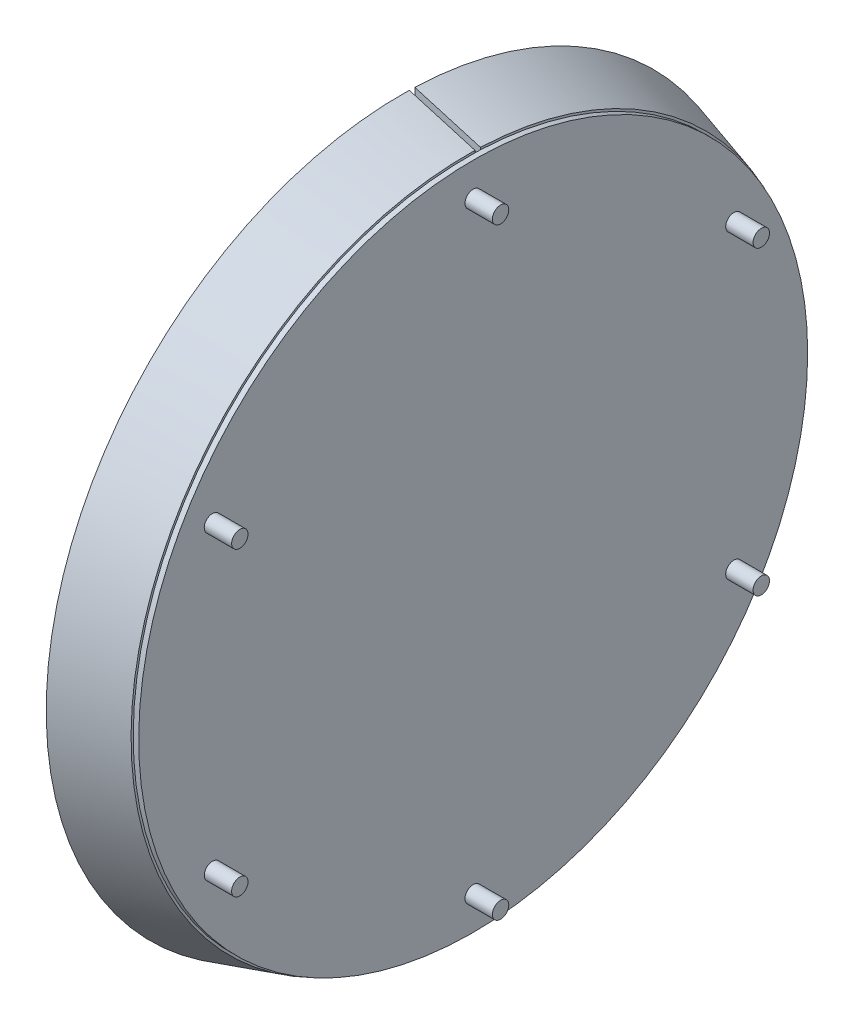
ISO-10303-21;
HEADER;
FILE_DESCRIPTION(('STEP AP214'),'2;1');
FILE_NAME('part.step','',(''),(''),'','','');
FILE_SCHEMA(('AUTOMOTIVE_DESIGN { 1 0 10303 214 1 1 1 1 }'));
ENDSEC;
DATA;
#1=APPLICATION_CONTEXT('core data for automotive mechanical design processes');
#2=APPLICATION_PROTOCOL_DEFINITION('international standard','automotive_design',2000,#1);
#3=PRODUCT_CONTEXT('',#1,'mechanical');
#4=PRODUCT('Part','Part','',(#3));
#5=PRODUCT_RELATED_PRODUCT_CATEGORY('part','',(#4));
#6=PRODUCT_DEFINITION_FORMATION('','',#4);
#7=PRODUCT_DEFINITION_CONTEXT('part definition',#1,'design');
#8=PRODUCT_DEFINITION('design','',#6,#7);
#9=PRODUCT_DEFINITION_SHAPE('','',#8);
#10=(LENGTH_UNIT() NAMED_UNIT(*) SI_UNIT(.MILLI.,.METRE.));
#11=(NAMED_UNIT(*) PLANE_ANGLE_UNIT() SI_UNIT($,.RADIAN.));
#12=(NAMED_UNIT(*) SI_UNIT($,.STERADIAN.) SOLID_ANGLE_UNIT());
#13=UNCERTAINTY_MEASURE_WITH_UNIT(LENGTH_MEASURE(1.E-05),#10,'distance_accuracy_value','');
#14=(GEOMETRIC_REPRESENTATION_CONTEXT(3) GLOBAL_UNCERTAINTY_ASSIGNED_CONTEXT((#13)) GLOBAL_UNIT_ASSIGNED_CONTEXT((#10,
#11,#12)) REPRESENTATION_CONTEXT('',''));
#15=CARTESIAN_POINT('',(0.,0.,0.));
#16=DIRECTION('',(0.,0.,1.));
#17=DIRECTION('',(1.,0.,0.));
#18=AXIS2_PLACEMENT_3D('',#15,#16,#17);
#19=CARTESIAN_POINT('',(12.,0.,0.));
#20=DIRECTION('',(-1.,0.,0.));
#21=DIRECTION('',(0.,0.,1.));
#22=AXIS2_PLACEMENT_3D('',#19,#20,#21);
#23=CONICAL_SURFACE('',#22,61.5,0.283794109208328);
#24=CARTESIAN_POINT('',(12.,0.,0.));
#25=DIRECTION('',(-1.,0.,0.));
#26=DIRECTION('',(0.,0.,1.));
#27=AXIS2_PLACEMENT_3D('',#24,#25,#26);
#28=CIRCLE('',#27,61.5);
#29=CARTESIAN_POINT('',(12.,61.4559242696827,-2.32795450106531));
#30=VERTEX_POINT('',#29);
#31=CARTESIAN_POINT('',(12.,61.485661229616,-1.32795450106531));
#32=VERTEX_POINT('',#31);
#33=EDGE_CURVE('E108',#30,#32,#28,.T.);
#34=ORIENTED_EDGE('',*,*,#33,.T.);
#35=CARTESIAN_POINT('',(24.8748500304677,57.72956394357,-1.32795450106531));
#36=CARTESIAN_POINT('',(18.5832524393234,59.5650919039046,-1.32795450106531));
#37=CARTESIAN_POINT('',(12.2916453053325,61.4005871531755,-1.32795450106531));
#38=CARTESIAN_POINT('',(-0.291588048312617,65.0715122295808,-1.32795450106531));
#39=CARTESIAN_POINT('',(-6.5832142679669,66.9069420567153,-1.32795450106531));
#40=CARTESIAN_POINT('',(-12.8748500304677,68.7423391727859,-1.32795450106531));
#41=B_SPLINE_CURVE_WITH_KNOTS('',3,(#35,#36,#37,#38,#39,#40),.UNSPECIFIED.,.F.,.F.,(4,2,4),(0.,
19.6616445967071,39.3232891933217),.UNSPECIFIED.);
#42=CARTESIAN_POINT('',(0.,64.9864334830209,-1.32795450106531));
#43=VERTEX_POINT('',#42);
#44=EDGE_CURVE('E179',#32,#43,#41,.T.);
#45=ORIENTED_EDGE('',*,*,#44,.T.);
#46=CARTESIAN_POINT('',(0.,0.,0.));
#47=DIRECTION('',(-1.,0.,0.));
#48=DIRECTION('',(0.,0.,1.));
#49=AXIS2_PLACEMENT_3D('',#46,#47,#48);
#50=CIRCLE('',#49,65.);
#51=CARTESIAN_POINT('',(0.,64.9582991452283,-2.32795450106531));
#52=VERTEX_POINT('',#51);
#53=EDGE_CURVE('E196',#52,#43,#50,.T.);
#54=ORIENTED_EDGE('',*,*,#53,.F.);
#55=CARTESIAN_POINT('',(-12.8748500304677,68.7157426354703,-2.32795450106531));
#56=CARTESIAN_POINT('',(-6.58317459645106,66.8796353721569,-2.32795450106531));
#57=CARTESIAN_POINT('',(-0.291528541101549,65.0434274507546,-2.32795450106531));
#58=CARTESIAN_POINT('',(12.2917048125436,61.3708102916908,-2.32795450106531));
#59=CARTESIAN_POINT('',(18.5832921108392,59.5344010540293,-2.32795450106531));
#60=CARTESIAN_POINT('',(24.8748500304677,57.6978911582789,-2.32795450106531));
#61=B_SPLINE_CURVE_WITH_KNOTS('',3,(#55,#56,#57,#58,#59,#60),.UNSPECIFIED.,.F.,.F.,(4,2,4),(0.,
19.66235556966,39.3247111401961),.UNSPECIFIED.);
#62=EDGE_CURVE('E208',#52,#30,#61,.T.);
#63=ORIENTED_EDGE('',*,*,#62,.T.);
#64=EDGE_LOOP('',(#34,#45,#54,#63));
#65=FACE_BOUND('',#64,.T.);
#66=ADVANCED_FACE('F39',(#65),#23,.T.);
#67=CARTESIAN_POINT('',(0.,65.,0.));
#68=DIRECTION('',(1.,0.,0.));
#69=DIRECTION('',(0.,0.,-1.));
#70=AXIS2_PLACEMENT_3D('',#67,#68,#69);
#71=PLANE('',#70);
#72=ORIENTED_EDGE('',*,*,#53,.T.);
#73=DIRECTION('',(0.,1.,0.));
#74=VECTOR('',#73,1.);
#75=CARTESIAN_POINT('',(0.,69.3356014956887,-1.32795450106531));
#76=LINE('',#75,#74);
#77=CARTESIAN_POINT('',(0.,63.4861129448252,-1.32795450106531));
#78=VERTEX_POINT('',#77);
#79=EDGE_CURVE('E131',#78,#43,#76,.T.);
#80=ORIENTED_EDGE('',*,*,#79,.F.);
#81=CARTESIAN_POINT('',(0.,0.,0.));
#82=DIRECTION('',(-1.,0.,0.));
#83=DIRECTION('',(0.,0.,1.));
#84=AXIS2_PLACEMENT_3D('',#81,#82,#83);
#85=CIRCLE('',#84,63.5);
#86=CARTESIAN_POINT('',(0.,63.4573134306911,-2.32795450106531));
#87=VERTEX_POINT('',#86);
#88=EDGE_CURVE('E193',#87,#78,#85,.T.);
#89=ORIENTED_EDGE('',*,*,#88,.F.);
#90=DIRECTION('',(0.,-1.,0.));
#91=VECTOR('',#90,1.);
#92=CARTESIAN_POINT('',(0.,69.3356014956887,-2.32795450106531));
#93=LINE('',#92,#91);
#94=EDGE_CURVE('E128',#52,#87,#93,.T.);
#95=ORIENTED_EDGE('',*,*,#94,.F.);
#96=EDGE_LOOP('',(#72,#80,#89,#95));
#97=FACE_BOUND('',#96,.T.);
#98=ADVANCED_FACE('F221',(#97),#71,.F.);
#99=CARTESIAN_POINT('',(0.,0.,0.));
#100=DIRECTION('',(-1.,0.,0.));
#101=DIRECTION('',(0.,0.,1.));
#102=AXIS2_PLACEMENT_3D('',#99,#100,#101);
#103=CONICAL_SURFACE('',#102,63.5,0.283794109208328);
#104=ORIENTED_EDGE('',*,*,#88,.T.);
#105=CARTESIAN_POINT('',(-12.4104142565746,67.1065661699587,-1.32795450106531));
#106=CARTESIAN_POINT('',(-6.27358999018868,65.3163144768907,-1.32795450106531));
#107=CARTESIAN_POINT('',(-0.136775480907874,63.5260293386864,-1.32795450106531));
#108=CARTESIAN_POINT('',(12.1368340234752,59.9453921719959,-1.32795450106531));
#109=CARTESIAN_POINT('',(18.2736290185775,58.1550401435098,-1.32795450106531));
#110=CARTESIAN_POINT('',(24.4104142565746,56.3646546698873,-1.32795450106531));
#111=B_SPLINE_CURVE_WITH_KNOTS('',3,(#105,#106,#107,#108,#109,#110),.UNSPECIFIED.,.F.,.F.,(4,2,
4),(0.,19.1778653341959,38.3557306684908),.UNSPECIFIED.);
#112=CARTESIAN_POINT('',(10.7992679571681,60.3356014956887,-1.32795450106531));
#113=VERTEX_POINT('',#112);
#114=EDGE_CURVE('E173',#78,#113,#111,.T.);
#115=ORIENTED_EDGE('',*,*,#114,.T.);
#116=CARTESIAN_POINT('',(10.8493662865738,60.3356014956887,0.0007));
#117=CARTESIAN_POINT('',(10.8492626563981,60.3356014956887,-0.389216240692867));
#118=CARTESIAN_POINT('',(10.8363763960981,60.3356014956887,-0.77828731402102));
#119=CARTESIAN_POINT('',(10.78503863594,60.3356014956887,-1.55473881301361));
#120=CARTESIAN_POINT('',(10.7465871566891,60.3356014956887,-1.94211924004056));
#121=CARTESIAN_POINT('',(10.695353067921,60.3356014956887,-2.32865450106531));
#122=B_SPLINE_CURVE_WITH_KNOTS('',3,(#116,#117,#118,#119,#120,#121),.UNSPECIFIED.,.F.,.F.,(4,2,
4),(0.,1.16785324516703,2.33570554897153),.UNSPECIFIED.);
#123=CARTESIAN_POINT('',(10.6954456131966,60.3356014956887,-2.32795450106531));
#124=VERTEX_POINT('',#123);
#125=EDGE_CURVE('E134',#113,#124,#122,.T.);
#126=ORIENTED_EDGE('',*,*,#125,.T.);
#127=CARTESIAN_POINT('',(24.4104142565746,56.33221446964,-2.32795450106531));
#128=CARTESIAN_POINT('',(18.2736695860542,58.1236047489806,-2.32795450106531));
#129=CARTESIAN_POINT('',(12.1368948746232,59.9148921046917,-2.32795450106531));
#130=CARTESIAN_POINT('',(-0.136714629759915,63.4972609687671,-2.32795450106531));
#131=CARTESIAN_POINT('',(-6.27354942271195,65.2883424771314,-2.32795450106531));
#132=CARTESIAN_POINT('',(-12.4104142565746,67.0793210618661,-2.32795450106531));
#133=B_SPLINE_CURVE_WITH_KNOTS('',3,(#127,#128,#129,#130,#131,#132),.UNSPECIFIED.,.F.,.F.,(4,2,
4),(0.,19.1785929683673,38.3571859357964),.UNSPECIFIED.);
#134=EDGE_CURVE('E150',#124,#87,#133,.T.);
#135=ORIENTED_EDGE('',*,*,#134,.T.);
#136=EDGE_LOOP('',(#104,#115,#126,#135));
#137=FACE_BOUND('',#136,.T.);
#138=CARTESIAN_POINT('',(12.,0.,0.));
#139=DIRECTION('',(-1.,0.,0.));
#140=DIRECTION('',(0.,0.,1.));
#141=AXIS2_PLACEMENT_3D('',#138,#139,#140);
#142=CIRCLE('',#141,60.);
#143=CARTESIAN_POINT('',(12.,0.,60.));
#144=VERTEX_POINT('',#143);
#145=EDGE_CURVE('E189',#144,#144,#142,.T.);
#146=ORIENTED_EDGE('',*,*,#145,.F.);
#147=EDGE_LOOP('',(#146));
#148=FACE_BOUND('',#147,.T.);
#149=ADVANCED_FACE('F157',(#137,#148),#103,.F.);
#150=CARTESIAN_POINT('',(12.,60.,0.));
#151=DIRECTION('',(-1.,0.,0.));
#152=DIRECTION('',(0.,0.,1.));
#153=AXIS2_PLACEMENT_3D('',#150,#151,#152);
#154=PLANE('',#153);
#155=CARTESIAN_POINT('',(12.,0.,0.));
#156=DIRECTION('',(1.,0.,0.));
#157=DIRECTION('',(0.,0.,-1.));
#158=AXIS2_PLACEMENT_3D('',#155,#156,#157);
#159=CIRCLE('',#158,61.1026853109702);
#160=CARTESIAN_POINT('',(12.,61.0882532820718,-1.32795450106531));
#161=VERTEX_POINT('',#160);
#162=CARTESIAN_POINT('',(12.,61.0583227746425,-2.32795450106531));
#163=VERTEX_POINT('',#162);
#164=EDGE_CURVE('E11',#161,#163,#159,.T.);
#165=ORIENTED_EDGE('',*,*,#164,.F.);
#166=DIRECTION('',(0.,1.,0.));
#167=VECTOR('',#166,1.);
#168=CARTESIAN_POINT('',(12.,60.,-1.32795450106531));
#169=LINE('',#168,#167);
#170=EDGE_CURVE('E199',#161,#32,#169,.T.);
#171=ORIENTED_EDGE('',*,*,#170,.T.);
#172=ORIENTED_EDGE('',*,*,#33,.F.);
#173=DIRECTION('',(0.,1.,0.));
#174=VECTOR('',#173,1.);
#175=CARTESIAN_POINT('',(12.,69.3356014956887,-2.32795450106531));
#176=LINE('',#175,#174);
#177=EDGE_CURVE('E96',#163,#30,#176,.T.);
#178=ORIENTED_EDGE('',*,*,#177,.F.);
#179=EDGE_LOOP('',(#165,#171,#172,#178));
#180=FACE_BOUND('',#179,.T.);
#181=ADVANCED_FACE('F106',(#180),#154,.F.);
#182=CARTESIAN_POINT('',(-9.05538513813742,69.3356014956887,-1.32795450106531));
#183=DIRECTION('',(0.,0.,1.));
#184=DIRECTION('',(0.,-1.,0.));
#185=AXIS2_PLACEMENT_3D('',#182,#183,#184);
#186=PLANE('',#185);
#187=CARTESIAN_POINT('',(12.,60.3356014956887,-1.32795450106531));
#188=VERTEX_POINT('',#187);
#189=EDGE_CURVE('E43',#188,#161,#169,.T.);
#190=ORIENTED_EDGE('',*,*,#189,.F.);
#191=DIRECTION('',(1.,0.,0.));
#192=VECTOR('',#191,1.);
#193=CARTESIAN_POINT('',(-9.05538513813742,60.3356014956887,-1.32795450106531));
#194=LINE('',#193,#192);
#195=EDGE_CURVE('E63',#113,#188,#194,.T.);
#196=ORIENTED_EDGE('',*,*,#195,.F.);
#197=ORIENTED_EDGE('',*,*,#114,.F.);
#198=ORIENTED_EDGE('',*,*,#79,.T.);
#199=ORIENTED_EDGE('',*,*,#44,.F.);
#200=ORIENTED_EDGE('',*,*,#170,.F.);
#201=EDGE_LOOP('',(#190,#196,#197,#198,#199,#200));
#202=FACE_BOUND('',#201,.T.);
#203=ADVANCED_FACE('F167',(#202),#186,.F.);
#204=CARTESIAN_POINT('',(-9.05538513813742,69.3356014956887,-2.32795450106531));
#205=DIRECTION('',(0.,0.,-1.));
#206=DIRECTION('',(0.,1.,0.));
#207=AXIS2_PLACEMENT_3D('',#204,#205,#206);
#208=PLANE('',#207);
#209=ORIENTED_EDGE('',*,*,#94,.T.);
#210=ORIENTED_EDGE('',*,*,#134,.F.);
#211=DIRECTION('',(1.,0.,0.));
#212=VECTOR('',#211,1.);
#213=CARTESIAN_POINT('',(-9.05538513813742,60.3356014956887,-2.32795450106531));
#214=LINE('',#213,#212);
#215=CARTESIAN_POINT('',(12.,60.3356014956887,-2.32795450106531));
#216=VERTEX_POINT('',#215);
#217=EDGE_CURVE('E99',#124,#216,#214,.T.);
#218=ORIENTED_EDGE('',*,*,#217,.T.);
#219=EDGE_CURVE('E94',#216,#163,#176,.T.);
#220=ORIENTED_EDGE('',*,*,#219,.T.);
#221=ORIENTED_EDGE('',*,*,#177,.T.);
#222=ORIENTED_EDGE('',*,*,#62,.F.);
#223=EDGE_LOOP('',(#209,#210,#218,#220,#221,#222));
#224=FACE_BOUND('',#223,.T.);
#225=ADVANCED_FACE('F95',(#224),#208,.F.);
#226=CARTESIAN_POINT('',(-9.05538513813742,60.3356014956887,-1.32795450106531));
#227=DIRECTION('',(0.,-1.,0.));
#228=DIRECTION('',(0.,0.,-1.));
#229=AXIS2_PLACEMENT_3D('',#226,#227,#228);
#230=PLANE('',#229);
#231=ORIENTED_EDGE('',*,*,#195,.T.);
#232=DIRECTION('',(0.,0.,-1.));
#233=VECTOR('',#232,1.);
#234=CARTESIAN_POINT('',(12.,60.3356014956887,-1.32795450106531));
#235=LINE('',#234,#233);
#236=EDGE_CURVE('E110',#188,#216,#235,.T.);
#237=ORIENTED_EDGE('',*,*,#236,.T.);
#238=ORIENTED_EDGE('',*,*,#217,.F.);
#239=ORIENTED_EDGE('',*,*,#125,.F.);
#240=EDGE_LOOP('',(#231,#237,#238,#239));
#241=FACE_BOUND('',#240,.T.);
#242=ADVANCED_FACE('F160',(#241),#230,.F.);
#243=CARTESIAN_POINT('',(13.,0.,0.));
#244=DIRECTION('',(1.,0.,0.));
#245=DIRECTION('',(0.,0.,-1.));
#246=AXIS2_PLACEMENT_3D('',#243,#244,#245);
#247=PLANE('',#246);
#248=CARTESIAN_POINT('',(13.,27.5000000000006,-47.6313972081438));
#249=DIRECTION('',(1.,0.,0.));
#250=DIRECTION('',(0.,-0.866025403784433,-0.50000000000001));
#251=AXIS2_PLACEMENT_3D('',#248,#249,#250);
#252=CIRCLE('',#251,1.5);
#253=CARTESIAN_POINT('',(13.,26.2009618943239,-48.3813972081438));
#254=VERTEX_POINT('',#253);
#255=EDGE_CURVE('E428',#254,#254,#252,.T.);
#256=ORIENTED_EDGE('',*,*,#255,.F.);
#257=EDGE_LOOP('',(#256));
#258=FACE_BOUND('',#257,.T.);
#259=CARTESIAN_POINT('',(13.,-27.4999999999996,-47.6313972081444));
#260=DIRECTION('',(1.,0.,0.));
#261=DIRECTION('',(0.,-0.866025403784443,0.499999999999992));
#262=AXIS2_PLACEMENT_3D('',#259,#260,#261);
#263=CIRCLE('',#262,1.5);
#264=CARTESIAN_POINT('',(13.,-28.7990381056762,-46.8813972081444));
#265=VERTEX_POINT('',#264);
#266=EDGE_CURVE('E427',#265,#265,#263,.T.);
#267=ORIENTED_EDGE('',*,*,#266,.F.);
#268=EDGE_LOOP('',(#267));
#269=FACE_BOUND('',#268,.T.);
#270=CARTESIAN_POINT('',(13.,-55.,0.));
#271=DIRECTION('',(1.,0.,0.));
#272=DIRECTION('',(0.,0.,1.));
#273=AXIS2_PLACEMENT_3D('',#270,#271,#272);
#274=CIRCLE('',#273,1.5);
#275=CARTESIAN_POINT('',(13.,-55.,1.5));
#276=VERTEX_POINT('',#275);
#277=EDGE_CURVE('E440',#276,#276,#274,.T.);
#278=ORIENTED_EDGE('',*,*,#277,.F.);
#279=EDGE_LOOP('',(#278));
#280=FACE_BOUND('',#279,.T.);
#281=CARTESIAN_POINT('',(13.,-27.5000000000002,47.631397208144));
#282=DIRECTION('',(1.,0.,0.));
#283=DIRECTION('',(0.,0.866025403784436,0.500000000000004));
#284=AXIS2_PLACEMENT_3D('',#281,#282,#283);
#285=CIRCLE('',#284,1.5);
#286=CARTESIAN_POINT('',(13.,-26.2009618943236,48.381397208144));
#287=VERTEX_POINT('',#286);
#288=EDGE_CURVE('E446',#287,#287,#285,.T.);
#289=ORIENTED_EDGE('',*,*,#288,.F.);
#290=EDGE_LOOP('',(#289));
#291=FACE_BOUND('',#290,.T.);
#292=CARTESIAN_POINT('',(13.,27.4999999999999,47.6313972081442));
#293=DIRECTION('',(1.,0.,0.));
#294=DIRECTION('',(0.,0.86602540378444,-0.499999999999998));
#295=AXIS2_PLACEMENT_3D('',#292,#293,#294);
#296=CIRCLE('',#295,1.5);
#297=CARTESIAN_POINT('',(13.,28.7990381056766,46.8813972081442));
#298=VERTEX_POINT('',#297);
#299=EDGE_CURVE('E454',#298,#298,#296,.T.);
#300=ORIENTED_EDGE('',*,*,#299,.F.);
#301=EDGE_LOOP('',(#300));
#302=FACE_BOUND('',#301,.T.);
#303=CARTESIAN_POINT('',(13.,55.,0.));
#304=DIRECTION('',(1.,0.,0.));
#305=DIRECTION('',(0.,0.,-1.));
#306=AXIS2_PLACEMENT_3D('',#303,#304,#305);
#307=CIRCLE('',#306,1.5);
#308=CARTESIAN_POINT('',(13.,55.,-1.5));
#309=VERTEX_POINT('',#308);
#310=EDGE_CURVE('E124',#309,#309,#307,.T.);
#311=ORIENTED_EDGE('',*,*,#310,.F.);
#312=EDGE_LOOP('',(#311));
#313=FACE_BOUND('',#312,.T.);
#314=CARTESIAN_POINT('',(13.,0.,0.));
#315=DIRECTION('',(1.,0.,0.));
#316=DIRECTION('',(0.,0.,-1.));
#317=AXIS2_PLACEMENT_3D('',#314,#315,#316);
#318=CIRCLE('',#317,61.1026853109702);
#319=CARTESIAN_POINT('',(13.,0.,-61.1026853109702));
#320=VERTEX_POINT('',#319);
#321=EDGE_CURVE('E117',#320,#320,#318,.T.);
#322=ORIENTED_EDGE('',*,*,#321,.T.);
#323=EDGE_LOOP('',(#322));
#324=FACE_BOUND('',#323,.T.);
#325=ADVANCED_FACE('F164',(#258,#269,#280,#291,#302,#313,#324),#247,.T.);
#326=CARTESIAN_POINT('',(13.,0.,0.));
#327=DIRECTION('',(-1.,0.,0.));
#328=DIRECTION('',(0.,0.,1.));
#329=AXIS2_PLACEMENT_3D('',#326,#327,#328);
#330=CYLINDRICAL_SURFACE('',#329,61.1026853109702);
#331=ORIENTED_EDGE('',*,*,#321,.F.);
#332=EDGE_LOOP('',(#331));
#333=FACE_BOUND('',#332,.T.);
#334=EDGE_CURVE('E50',#163,#161,#159,.T.);
#335=ORIENTED_EDGE('',*,*,#334,.T.);
#336=ORIENTED_EDGE('',*,*,#164,.T.);
#337=EDGE_LOOP('',(#335,#336));
#338=FACE_BOUND('',#337,.T.);
#339=ADVANCED_FACE('F113',(#333,#338),#330,.T.);
#340=CARTESIAN_POINT('',(12.,0.,0.));
#341=DIRECTION('',(1.,0.,0.));
#342=DIRECTION('',(0.,0.,-1.));
#343=AXIS2_PLACEMENT_3D('',#340,#341,#342);
#344=PLANE('',#343);
#345=ORIENTED_EDGE('',*,*,#236,.F.);
#346=ORIENTED_EDGE('',*,*,#189,.T.);
#347=ORIENTED_EDGE('',*,*,#334,.F.);
#348=ORIENTED_EDGE('',*,*,#219,.F.);
#349=EDGE_LOOP('',(#345,#346,#347,#348));
#350=FACE_BOUND('',#349,.T.);
#351=ADVANCED_FACE('F115',(#350),#344,.F.);
#352=ORIENTED_EDGE('',*,*,#145,.T.);
#353=EDGE_LOOP('',(#352));
#354=FACE_BOUND('',#353,.T.);
#355=ADVANCED_FACE('F284',(#354),#344,.F.);
#356=CARTESIAN_POINT('',(18.,55.,0.));
#357=DIRECTION('',(-1.,0.,0.));
#358=DIRECTION('',(0.,0.,1.));
#359=AXIS2_PLACEMENT_3D('',#356,#357,#358);
#360=CYLINDRICAL_SURFACE('',#359,1.5);
#361=CARTESIAN_POINT('',(18.,55.,0.));
#362=DIRECTION('',(1.,0.,0.));
#363=DIRECTION('',(0.,0.,-1.));
#364=AXIS2_PLACEMENT_3D('',#361,#362,#363);
#365=CIRCLE('',#364,1.5);
#366=CARTESIAN_POINT('',(18.,55.,-1.5));
#367=VERTEX_POINT('',#366);
#368=EDGE_CURVE('E118',#367,#367,#365,.T.);
#369=ORIENTED_EDGE('',*,*,#368,.F.);
#370=EDGE_LOOP('',(#369));
#371=FACE_BOUND('',#370,.T.);
#372=ORIENTED_EDGE('',*,*,#310,.T.);
#373=EDGE_LOOP('',(#372));
#374=FACE_BOUND('',#373,.T.);
#375=ADVANCED_FACE('F293',(#371,#374),#360,.T.);
#376=CARTESIAN_POINT('',(18.,55.,0.));
#377=DIRECTION('',(1.,0.,0.));
#378=DIRECTION('',(0.,0.,-1.));
#379=AXIS2_PLACEMENT_3D('',#376,#377,#378);
#380=PLANE('',#379);
#381=ORIENTED_EDGE('',*,*,#368,.T.);
#382=EDGE_LOOP('',(#381));
#383=FACE_BOUND('',#382,.T.);
#384=ADVANCED_FACE('F302',(#383),#380,.T.);
#385=CARTESIAN_POINT('',(18.,27.4999999999999,47.6313972081442));
#386=DIRECTION('',(-1.,0.,0.));
#387=DIRECTION('',(0.,0.,1.));
#388=AXIS2_PLACEMENT_3D('',#385,#386,#387);
#389=CYLINDRICAL_SURFACE('',#388,1.5);
#390=CARTESIAN_POINT('',(18.,27.4999999999999,47.6313972081442));
#391=DIRECTION('',(1.,0.,0.));
#392=DIRECTION('',(0.,0.86602540378444,-0.499999999999998));
#393=AXIS2_PLACEMENT_3D('',#390,#391,#392);
#394=CIRCLE('',#393,1.5);
#395=CARTESIAN_POINT('',(18.,28.7990381056766,46.8813972081442));
#396=VERTEX_POINT('',#395);
#397=EDGE_CURVE('E458',#396,#396,#394,.T.);
#398=ORIENTED_EDGE('',*,*,#397,.F.);
#399=EDGE_LOOP('',(#398));
#400=FACE_BOUND('',#399,.T.);
#401=ORIENTED_EDGE('',*,*,#299,.T.);
#402=EDGE_LOOP('',(#401));
#403=FACE_BOUND('',#402,.T.);
#404=ADVANCED_FACE('F312',(#400,#403),#389,.T.);
#405=CARTESIAN_POINT('',(18.,27.4999999999999,47.6313972081442));
#406=DIRECTION('',(1.,0.,0.));
#407=DIRECTION('',(0.,0.86602540378444,-0.499999999999998));
#408=AXIS2_PLACEMENT_3D('',#405,#406,#407);
#409=PLANE('',#408);
#410=ORIENTED_EDGE('',*,*,#397,.T.);
#411=EDGE_LOOP('',(#410));
#412=FACE_BOUND('',#411,.T.);
#413=ADVANCED_FACE('F329',(#412),#409,.T.);
#414=CARTESIAN_POINT('',(18.,-27.5000000000002,47.631397208144));
#415=DIRECTION('',(-1.,0.,0.));
#416=DIRECTION('',(0.,0.,1.));
#417=AXIS2_PLACEMENT_3D('',#414,#415,#416);
#418=CYLINDRICAL_SURFACE('',#417,1.5);
#419=CARTESIAN_POINT('',(18.,-27.5000000000002,47.631397208144));
#420=DIRECTION('',(1.,0.,0.));
#421=DIRECTION('',(0.,0.866025403784436,0.500000000000004));
#422=AXIS2_PLACEMENT_3D('',#419,#420,#421);
#423=CIRCLE('',#422,1.5);
#424=CARTESIAN_POINT('',(18.,-26.2009618943236,48.381397208144));
#425=VERTEX_POINT('',#424);
#426=EDGE_CURVE('E450',#425,#425,#423,.T.);
#427=ORIENTED_EDGE('',*,*,#426,.F.);
#428=EDGE_LOOP('',(#427));
#429=FACE_BOUND('',#428,.T.);
#430=ORIENTED_EDGE('',*,*,#288,.T.);
#431=EDGE_LOOP('',(#430));
#432=FACE_BOUND('',#431,.T.);
#433=ADVANCED_FACE('F339',(#429,#432),#418,.T.);
#434=CARTESIAN_POINT('',(18.,-27.5000000000002,47.631397208144));
#435=DIRECTION('',(1.,0.,0.));
#436=DIRECTION('',(0.,0.866025403784436,0.500000000000004));
#437=AXIS2_PLACEMENT_3D('',#434,#435,#436);
#438=PLANE('',#437);
#439=ORIENTED_EDGE('',*,*,#426,.T.);
#440=EDGE_LOOP('',(#439));
#441=FACE_BOUND('',#440,.T.);
#442=ADVANCED_FACE('F349',(#441),#438,.T.);
#443=CARTESIAN_POINT('',(18.,-55.,0.));
#444=DIRECTION('',(-1.,0.,0.));
#445=DIRECTION('',(0.,0.,1.));
#446=AXIS2_PLACEMENT_3D('',#443,#444,#445);
#447=CYLINDRICAL_SURFACE('',#446,1.5);
#448=CARTESIAN_POINT('',(18.,-55.,0.));
#449=DIRECTION('',(1.,0.,0.));
#450=DIRECTION('',(0.,0.,1.));
#451=AXIS2_PLACEMENT_3D('',#448,#449,#450);
#452=CIRCLE('',#451,1.5);
#453=CARTESIAN_POINT('',(18.,-55.,1.5));
#454=VERTEX_POINT('',#453);
#455=EDGE_CURVE('E442',#454,#454,#452,.T.);
#456=ORIENTED_EDGE('',*,*,#455,.F.);
#457=EDGE_LOOP('',(#456));
#458=FACE_BOUND('',#457,.T.);
#459=ORIENTED_EDGE('',*,*,#277,.T.);
#460=EDGE_LOOP('',(#459));
#461=FACE_BOUND('',#460,.T.);
#462=ADVANCED_FACE('F359',(#458,#461),#447,.T.);
#463=CARTESIAN_POINT('',(18.,-55.,0.));
#464=DIRECTION('',(1.,0.,0.));
#465=DIRECTION('',(0.,0.,1.));
#466=AXIS2_PLACEMENT_3D('',#463,#464,#465);
#467=PLANE('',#466);
#468=ORIENTED_EDGE('',*,*,#455,.T.);
#469=EDGE_LOOP('',(#468));
#470=FACE_BOUND('',#469,.T.);
#471=ADVANCED_FACE('F369',(#470),#467,.T.);
#472=CARTESIAN_POINT('',(18.,-27.4999999999996,-47.6313972081444));
#473=DIRECTION('',(-1.,0.,0.));
#474=DIRECTION('',(0.,0.,1.));
#475=AXIS2_PLACEMENT_3D('',#472,#473,#474);
#476=CYLINDRICAL_SURFACE('',#475,1.5);
#477=CARTESIAN_POINT('',(18.,-27.4999999999996,-47.6313972081444));
#478=DIRECTION('',(1.,0.,0.));
#479=DIRECTION('',(0.,-0.866025403784443,0.499999999999992));
#480=AXIS2_PLACEMENT_3D('',#477,#478,#479);
#481=CIRCLE('',#480,1.5);
#482=CARTESIAN_POINT('',(18.,-28.7990381056762,-46.8813972081444));
#483=VERTEX_POINT('',#482);
#484=EDGE_CURVE('E433',#483,#483,#481,.T.);
#485=ORIENTED_EDGE('',*,*,#484,.F.);
#486=EDGE_LOOP('',(#485));
#487=FACE_BOUND('',#486,.T.);
#488=ORIENTED_EDGE('',*,*,#266,.T.);
#489=EDGE_LOOP('',(#488));
#490=FACE_BOUND('',#489,.T.);
#491=ADVANCED_FACE('F379',(#487,#490),#476,.T.);
#492=CARTESIAN_POINT('',(18.,-27.4999999999996,-47.6313972081444));
#493=DIRECTION('',(1.,0.,0.));
#494=DIRECTION('',(0.,-0.866025403784443,0.499999999999992));
#495=AXIS2_PLACEMENT_3D('',#492,#493,#494);
#496=PLANE('',#495);
#497=ORIENTED_EDGE('',*,*,#484,.T.);
#498=EDGE_LOOP('',(#497));
#499=FACE_BOUND('',#498,.T.);
#500=ADVANCED_FACE('F389',(#499),#496,.T.);
#501=CARTESIAN_POINT('',(18.,27.5000000000006,-47.6313972081438));
#502=DIRECTION('',(-1.,0.,0.));
#503=DIRECTION('',(0.,0.,1.));
#504=AXIS2_PLACEMENT_3D('',#501,#502,#503);
#505=CYLINDRICAL_SURFACE('',#504,1.5);
#506=CARTESIAN_POINT('',(18.,27.5000000000006,-47.6313972081438));
#507=DIRECTION('',(1.,0.,0.));
#508=DIRECTION('',(0.,-0.866025403784433,-0.50000000000001));
#509=AXIS2_PLACEMENT_3D('',#506,#507,#508);
#510=CIRCLE('',#509,1.5);
#511=CARTESIAN_POINT('',(18.,26.2009618943239,-48.3813972081438));
#512=VERTEX_POINT('',#511);
#513=EDGE_CURVE('E425',#512,#512,#510,.T.);
#514=ORIENTED_EDGE('',*,*,#513,.F.);
#515=EDGE_LOOP('',(#514));
#516=FACE_BOUND('',#515,.T.);
#517=ORIENTED_EDGE('',*,*,#255,.T.);
#518=EDGE_LOOP('',(#517));
#519=FACE_BOUND('',#518,.T.);
#520=ADVANCED_FACE('F399',(#516,#519),#505,.T.);
#521=CARTESIAN_POINT('',(18.,27.5000000000006,-47.6313972081438));
#522=DIRECTION('',(1.,0.,0.));
#523=DIRECTION('',(0.,-0.866025403784433,-0.50000000000001));
#524=AXIS2_PLACEMENT_3D('',#521,#522,#523);
#525=PLANE('',#524);
#526=ORIENTED_EDGE('',*,*,#513,.T.);
#527=EDGE_LOOP('',(#526));
#528=FACE_BOUND('',#527,.T.);
#529=ADVANCED_FACE('F409',(#528),#525,.T.);
#530=CLOSED_SHELL('',(#66,#98,#149,#181,#203,#225,#242,#325,#339,#351,#355,#375,#384,#404,#413,
#433,#442,#462,#471,#491,#500,#520,#529));
#531=MANIFOLD_SOLID_BREP('B2',#530);
#532=ADVANCED_BREP_SHAPE_REPRESENTATION('',(#18,#531),#14);
#533=SHAPE_DEFINITION_REPRESENTATION(#9,#532);
ENDSEC;
END-ISO-10303-21;
